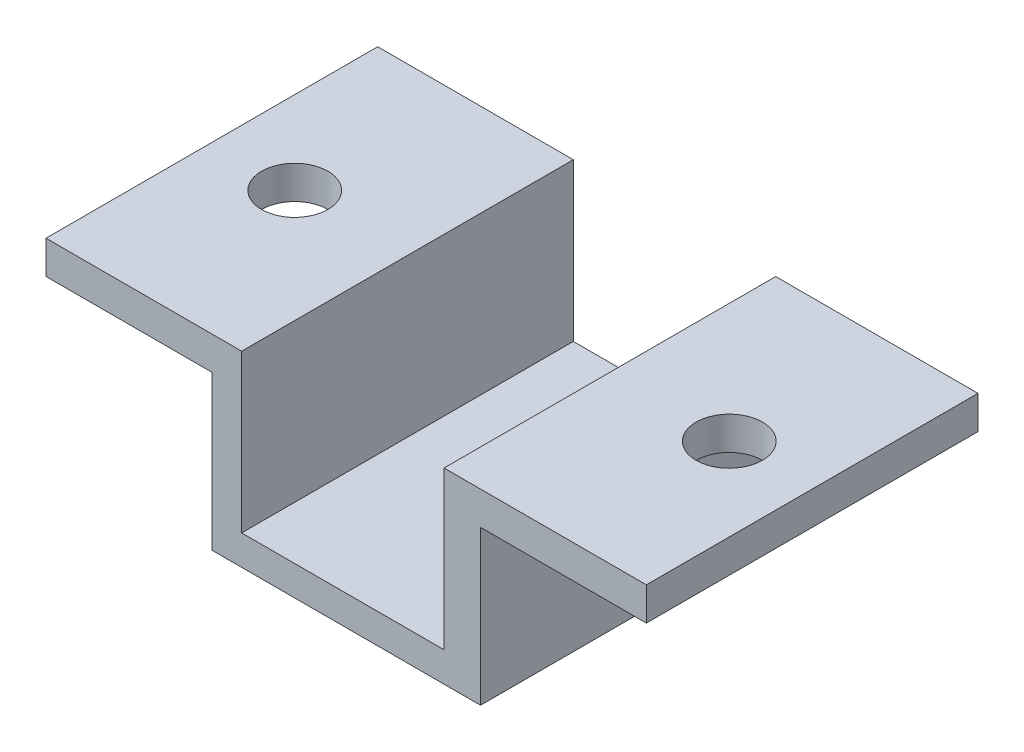
ISO-10303-21;
HEADER;
FILE_DESCRIPTION(('STEP AP214'),'2;1');
FILE_NAME('part.step','',(''),(''),'','','');
FILE_SCHEMA(('AUTOMOTIVE_DESIGN { 1 0 10303 214 1 1 1 1 }'));
ENDSEC;
DATA;
#1=APPLICATION_CONTEXT('core data for automotive mechanical design processes');
#2=APPLICATION_PROTOCOL_DEFINITION('international standard','automotive_design',2000,#1);
#3=PRODUCT_CONTEXT('',#1,'mechanical');
#4=PRODUCT('Part','Part','',(#3));
#5=PRODUCT_RELATED_PRODUCT_CATEGORY('part','',(#4));
#6=PRODUCT_DEFINITION_FORMATION('','',#4);
#7=PRODUCT_DEFINITION_CONTEXT('part definition',#1,'design');
#8=PRODUCT_DEFINITION('design','',#6,#7);
#9=PRODUCT_DEFINITION_SHAPE('','',#8);
#10=(LENGTH_UNIT() NAMED_UNIT(*) SI_UNIT(.MILLI.,.METRE.));
#11=(NAMED_UNIT(*) PLANE_ANGLE_UNIT() SI_UNIT($,.RADIAN.));
#12=(NAMED_UNIT(*) SI_UNIT($,.STERADIAN.) SOLID_ANGLE_UNIT());
#13=UNCERTAINTY_MEASURE_WITH_UNIT(LENGTH_MEASURE(1.E-05),#10,'distance_accuracy_value','');
#14=(GEOMETRIC_REPRESENTATION_CONTEXT(3) GLOBAL_UNCERTAINTY_ASSIGNED_CONTEXT((#13)) GLOBAL_UNIT_ASSIGNED_CONTEXT((#10,
#11,#12)) REPRESENTATION_CONTEXT('',''));
#15=CARTESIAN_POINT('',(0.,0.,0.));
#16=DIRECTION('',(0.,0.,1.));
#17=DIRECTION('',(1.,0.,0.));
#18=AXIS2_PLACEMENT_3D('',#15,#16,#17);
#19=CARTESIAN_POINT('',(0.,14.340000022,0.));
#20=DIRECTION('',(1.,0.,0.));
#21=DIRECTION('',(0.,0.,-1.));
#22=AXIS2_PLACEMENT_3D('',#19,#20,#21);
#23=PLANE('',#22);
#24=DIRECTION('',(0.,0.,-1.));
#25=VECTOR('',#24,1.);
#26=CARTESIAN_POINT('',(0.,11.800000022,0.));
#27=LINE('',#26,#25);
#28=CARTESIAN_POINT('',(0.,11.800000022,0.));
#29=VERTEX_POINT('',#28);
#30=CARTESIAN_POINT('',(0.,11.800000022,-25.4));
#31=VERTEX_POINT('',#30);
#32=EDGE_CURVE('E202',#29,#31,#27,.T.);
#33=ORIENTED_EDGE('',*,*,#32,.F.);
#34=DIRECTION('',(0.,-1.,0.));
#35=VECTOR('',#34,1.);
#36=CARTESIAN_POINT('',(0.,14.340000022,0.));
#37=LINE('',#36,#35);
#38=CARTESIAN_POINT('',(0.,14.340000022,0.));
#39=VERTEX_POINT('',#38);
#40=EDGE_CURVE('E11',#39,#29,#37,.T.);
#41=ORIENTED_EDGE('',*,*,#40,.F.);
#42=DIRECTION('',(0.,0.,1.));
#43=VECTOR('',#42,1.);
#44=CARTESIAN_POINT('',(0.,14.340000022,0.));
#45=LINE('',#44,#43);
#46=CARTESIAN_POINT('',(0.,14.340000022,-25.4));
#47=VERTEX_POINT('',#46);
#48=EDGE_CURVE('E155',#47,#39,#45,.T.);
#49=ORIENTED_EDGE('',*,*,#48,.F.);
#50=DIRECTION('',(0.,-1.,0.));
#51=VECTOR('',#50,1.);
#52=CARTESIAN_POINT('',(0.,14.340000022,-25.4));
#53=LINE('',#52,#51);
#54=EDGE_CURVE('E148',#47,#31,#53,.T.);
#55=ORIENTED_EDGE('',*,*,#54,.T.);
#56=EDGE_LOOP('',(#33,#41,#49,#55));
#57=FACE_BOUND('',#56,.T.);
#58=ADVANCED_FACE('F34',(#57),#23,.F.);
#59=CARTESIAN_POINT('',(0.,14.340000022,0.));
#60=DIRECTION('',(0.,-1.,0.));
#61=DIRECTION('',(0.,0.,-1.));
#62=AXIS2_PLACEMENT_3D('',#59,#60,#61);
#63=PLANE('',#62);
#64=CARTESIAN_POINT('',(6.35,14.340000022,-12.7));
#65=DIRECTION('',(0.,-1.,0.));
#66=DIRECTION('',(0.,0.,-1.));
#67=AXIS2_PLACEMENT_3D('',#64,#65,#66);
#68=CIRCLE('',#67,2.54);
#69=CARTESIAN_POINT('',(6.35,14.340000022,-15.24));
#70=VERTEX_POINT('',#69);
#71=EDGE_CURVE('E215',#70,#70,#68,.T.);
#72=ORIENTED_EDGE('',*,*,#71,.T.);
#73=EDGE_LOOP('',(#72));
#74=FACE_BOUND('',#73,.T.);
#75=DIRECTION('',(1.,0.,0.));
#76=VECTOR('',#75,1.);
#77=CARTESIAN_POINT('',(0.,14.340000022,0.));
#78=LINE('',#77,#76);
#79=CARTESIAN_POINT('',(14.986,14.340000022,0.));
#80=VERTEX_POINT('',#79);
#81=EDGE_CURVE('E163',#39,#80,#78,.T.);
#82=ORIENTED_EDGE('',*,*,#81,.T.);
#83=DIRECTION('',(0.,0.,1.));
#84=VECTOR('',#83,1.);
#85=CARTESIAN_POINT('',(14.986,14.340000022,0.));
#86=LINE('',#85,#84);
#87=CARTESIAN_POINT('',(14.986,14.340000022,-25.4));
#88=VERTEX_POINT('',#87);
#89=EDGE_CURVE('E182',#88,#80,#86,.T.);
#90=ORIENTED_EDGE('',*,*,#89,.F.);
#91=DIRECTION('',(-1.,0.,0.));
#92=VECTOR('',#91,1.);
#93=CARTESIAN_POINT('',(0.,14.340000022,-25.4));
#94=LINE('',#93,#92);
#95=EDGE_CURVE('E161',#88,#47,#94,.T.);
#96=ORIENTED_EDGE('',*,*,#95,.T.);
#97=ORIENTED_EDGE('',*,*,#48,.T.);
#98=EDGE_LOOP('',(#82,#90,#96,#97));
#99=FACE_BOUND('',#98,.T.);
#100=ADVANCED_FACE('F252',(#74,#99),#63,.F.);
#101=CARTESIAN_POINT('',(0.,14.340000022,0.));
#102=DIRECTION('',(0.,0.,-1.));
#103=DIRECTION('',(-1.,0.,0.));
#104=AXIS2_PLACEMENT_3D('',#101,#102,#103);
#105=PLANE('',#104);
#106=DIRECTION('',(1.,0.,0.));
#107=VECTOR('',#106,1.);
#108=CARTESIAN_POINT('',(0.,0.,0.));
#109=LINE('',#108,#107);
#110=CARTESIAN_POINT('',(12.7,0.,0.));
#111=VERTEX_POINT('',#110);
#112=CARTESIAN_POINT('',(33.279999988,0.,0.));
#113=VERTEX_POINT('',#112);
#114=EDGE_CURVE('E156',#111,#113,#109,.T.);
#115=ORIENTED_EDGE('',*,*,#114,.T.);
#116=DIRECTION('',(0.,-1.,0.));
#117=VECTOR('',#116,1.);
#118=CARTESIAN_POINT('',(33.279999988,11.800000022,0.));
#119=LINE('',#118,#117);
#120=CARTESIAN_POINT('',(33.279999988,11.800000022,0.));
#121=VERTEX_POINT('',#120);
#122=EDGE_CURVE('E48',#121,#113,#119,.T.);
#123=ORIENTED_EDGE('',*,*,#122,.F.);
#124=DIRECTION('',(-1.,0.,0.));
#125=VECTOR('',#124,1.);
#126=CARTESIAN_POINT('',(45.979999988,11.800000022,0.));
#127=LINE('',#126,#125);
#128=CARTESIAN_POINT('',(45.979999988,11.800000022,0.));
#129=VERTEX_POINT('',#128);
#130=EDGE_CURVE('E128',#129,#121,#127,.T.);
#131=ORIENTED_EDGE('',*,*,#130,.F.);
#132=DIRECTION('',(0.,-1.,0.));
#133=VECTOR('',#132,1.);
#134=CARTESIAN_POINT('',(45.979999988,14.340000022,0.));
#135=LINE('',#134,#133);
#136=CARTESIAN_POINT('',(45.979999988,14.340000022,0.));
#137=VERTEX_POINT('',#136);
#138=EDGE_CURVE('E41',#137,#129,#135,.T.);
#139=ORIENTED_EDGE('',*,*,#138,.F.);
#140=CARTESIAN_POINT('',(30.485999988,14.340000022,0.));
#141=VERTEX_POINT('',#140);
#142=EDGE_CURVE('E166',#141,#137,#78,.T.);
#143=ORIENTED_EDGE('',*,*,#142,.F.);
#144=DIRECTION('',(0.,1.,0.));
#145=VECTOR('',#144,1.);
#146=CARTESIAN_POINT('',(30.485999988,2.285998222,0.));
#147=LINE('',#146,#145);
#148=CARTESIAN_POINT('',(30.485999988,2.285998222,0.));
#149=VERTEX_POINT('',#148);
#150=EDGE_CURVE('E172',#149,#141,#147,.T.);
#151=ORIENTED_EDGE('',*,*,#150,.F.);
#152=DIRECTION('',(1.,0.,0.));
#153=VECTOR('',#152,1.);
#154=CARTESIAN_POINT('',(14.986,2.285998222,0.));
#155=LINE('',#154,#153);
#156=CARTESIAN_POINT('',(14.986,2.285998222,0.));
#157=VERTEX_POINT('',#156);
#158=EDGE_CURVE('E190',#157,#149,#155,.T.);
#159=ORIENTED_EDGE('',*,*,#158,.F.);
#160=DIRECTION('',(0.,1.,0.));
#161=VECTOR('',#160,1.);
#162=CARTESIAN_POINT('',(14.986,2.285998222,0.));
#163=LINE('',#162,#161);
#164=EDGE_CURVE('E169',#157,#80,#163,.T.);
#165=ORIENTED_EDGE('',*,*,#164,.T.);
#166=ORIENTED_EDGE('',*,*,#81,.F.);
#167=ORIENTED_EDGE('',*,*,#40,.T.);
#168=DIRECTION('',(-1.,0.,0.));
#169=VECTOR('',#168,1.);
#170=CARTESIAN_POINT('',(0.,11.800000022,0.));
#171=LINE('',#170,#169);
#172=CARTESIAN_POINT('',(12.7,11.800000022,0.));
#173=VERTEX_POINT('',#172);
#174=EDGE_CURVE('E197',#173,#29,#171,.T.);
#175=ORIENTED_EDGE('',*,*,#174,.F.);
#176=DIRECTION('',(0.,-1.,0.));
#177=VECTOR('',#176,1.);
#178=CARTESIAN_POINT('',(12.7,11.800000022,0.));
#179=LINE('',#178,#177);
#180=EDGE_CURVE('E184',#173,#111,#179,.T.);
#181=ORIENTED_EDGE('',*,*,#180,.T.);
#182=EDGE_LOOP('',(#115,#123,#131,#139,#143,#151,#159,#165,#166,#167,#175,#181));
#183=FACE_BOUND('',#182,.T.);
#184=ADVANCED_FACE('F140',(#183),#105,.F.);
#185=CARTESIAN_POINT('',(45.979999988,14.340000022,0.));
#186=DIRECTION('',(-1.,0.,0.));
#187=DIRECTION('',(0.,0.,1.));
#188=AXIS2_PLACEMENT_3D('',#185,#186,#187);
#189=PLANE('',#188);
#190=ORIENTED_EDGE('',*,*,#138,.T.);
#191=DIRECTION('',(0.,0.,1.));
#192=VECTOR('',#191,1.);
#193=CARTESIAN_POINT('',(45.979999988,11.800000022,0.));
#194=LINE('',#193,#192);
#195=CARTESIAN_POINT('',(45.979999988,11.800000022,-25.4));
#196=VERTEX_POINT('',#195);
#197=EDGE_CURVE('E124',#196,#129,#194,.T.);
#198=ORIENTED_EDGE('',*,*,#197,.F.);
#199=DIRECTION('',(0.,-1.,0.));
#200=VECTOR('',#199,1.);
#201=CARTESIAN_POINT('',(45.979999988,14.340000022,-25.4));
#202=LINE('',#201,#200);
#203=CARTESIAN_POINT('',(45.979999988,14.340000022,-25.4));
#204=VERTEX_POINT('',#203);
#205=EDGE_CURVE('E147',#204,#196,#202,.T.);
#206=ORIENTED_EDGE('',*,*,#205,.F.);
#207=DIRECTION('',(0.,0.,-1.));
#208=VECTOR('',#207,1.);
#209=CARTESIAN_POINT('',(45.979999988,14.340000022,0.));
#210=LINE('',#209,#208);
#211=EDGE_CURVE('E146',#137,#204,#210,.T.);
#212=ORIENTED_EDGE('',*,*,#211,.F.);
#213=EDGE_LOOP('',(#190,#198,#206,#212));
#214=FACE_BOUND('',#213,.T.);
#215=ADVANCED_FACE('F145',(#214),#189,.F.);
#216=CARTESIAN_POINT('',(0.,14.340000022,-25.4));
#217=DIRECTION('',(0.,0.,1.));
#218=DIRECTION('',(1.,0.,0.));
#219=AXIS2_PLACEMENT_3D('',#216,#217,#218);
#220=PLANE('',#219);
#221=DIRECTION('',(1.,0.,0.));
#222=VECTOR('',#221,1.);
#223=CARTESIAN_POINT('',(45.979999988,11.800000022,-25.4));
#224=LINE('',#223,#222);
#225=CARTESIAN_POINT('',(33.279999988,11.800000022,-25.4));
#226=VERTEX_POINT('',#225);
#227=EDGE_CURVE('E130',#226,#196,#224,.T.);
#228=ORIENTED_EDGE('',*,*,#227,.F.);
#229=DIRECTION('',(0.,-1.,0.));
#230=VECTOR('',#229,1.);
#231=CARTESIAN_POINT('',(33.279999988,11.800000022,-25.4));
#232=LINE('',#231,#230);
#233=CARTESIAN_POINT('',(33.279999988,0.,-25.4));
#234=VERTEX_POINT('',#233);
#235=EDGE_CURVE('E203',#226,#234,#232,.T.);
#236=ORIENTED_EDGE('',*,*,#235,.T.);
#237=DIRECTION('',(-1.,0.,0.));
#238=VECTOR('',#237,1.);
#239=CARTESIAN_POINT('',(0.,0.,-25.4));
#240=LINE('',#239,#238);
#241=CARTESIAN_POINT('',(12.7,0.,-25.4));
#242=VERTEX_POINT('',#241);
#243=EDGE_CURVE('E56',#234,#242,#240,.T.);
#244=ORIENTED_EDGE('',*,*,#243,.T.);
#245=DIRECTION('',(0.,-1.,0.));
#246=VECTOR('',#245,1.);
#247=CARTESIAN_POINT('',(12.7,11.800000022,-25.4));
#248=LINE('',#247,#246);
#249=CARTESIAN_POINT('',(12.7,11.800000022,-25.4));
#250=VERTEX_POINT('',#249);
#251=EDGE_CURVE('E195',#250,#242,#248,.T.);
#252=ORIENTED_EDGE('',*,*,#251,.F.);
#253=DIRECTION('',(1.,0.,0.));
#254=VECTOR('',#253,1.);
#255=CARTESIAN_POINT('',(0.,11.800000022,-25.4));
#256=LINE('',#255,#254);
#257=EDGE_CURVE('E208',#31,#250,#256,.T.);
#258=ORIENTED_EDGE('',*,*,#257,.F.);
#259=ORIENTED_EDGE('',*,*,#54,.F.);
#260=ORIENTED_EDGE('',*,*,#95,.F.);
#261=DIRECTION('',(0.,1.,0.));
#262=VECTOR('',#261,1.);
#263=CARTESIAN_POINT('',(14.986,2.285998222,-25.4));
#264=LINE('',#263,#262);
#265=CARTESIAN_POINT('',(14.986,2.285998222,-25.4));
#266=VERTEX_POINT('',#265);
#267=EDGE_CURVE('E158',#266,#88,#264,.T.);
#268=ORIENTED_EDGE('',*,*,#267,.F.);
#269=DIRECTION('',(-1.,0.,0.));
#270=VECTOR('',#269,1.);
#271=CARTESIAN_POINT('',(14.986,2.285998222,-25.4));
#272=LINE('',#271,#270);
#273=CARTESIAN_POINT('',(30.485999988,2.285998222,-25.4));
#274=VERTEX_POINT('',#273);
#275=EDGE_CURVE('E173',#274,#266,#272,.T.);
#276=ORIENTED_EDGE('',*,*,#275,.F.);
#277=DIRECTION('',(0.,1.,0.));
#278=VECTOR('',#277,1.);
#279=CARTESIAN_POINT('',(30.485999988,2.285998222,-25.4));
#280=LINE('',#279,#278);
#281=CARTESIAN_POINT('',(30.485999988,14.340000022,-25.4));
#282=VERTEX_POINT('',#281);
#283=EDGE_CURVE('E175',#274,#282,#280,.T.);
#284=ORIENTED_EDGE('',*,*,#283,.T.);
#285=EDGE_CURVE('E153',#204,#282,#94,.T.);
#286=ORIENTED_EDGE('',*,*,#285,.F.);
#287=ORIENTED_EDGE('',*,*,#205,.T.);
#288=EDGE_LOOP('',(#228,#236,#244,#252,#258,#259,#260,#268,#276,#284,#286,#287));
#289=FACE_BOUND('',#288,.T.);
#290=ADVANCED_FACE('F271',(#289),#220,.F.);
#291=CARTESIAN_POINT('',(39.629999988,14.340000022,-12.7));
#292=DIRECTION('',(0.,-1.,0.));
#293=DIRECTION('',(0.,0.,-1.));
#294=AXIS2_PLACEMENT_3D('',#291,#292,#293);
#295=CIRCLE('',#294,2.54);
#296=CARTESIAN_POINT('',(39.629999988,14.340000022,-15.24));
#297=VERTEX_POINT('',#296);
#298=EDGE_CURVE('E221',#297,#297,#295,.T.);
#299=ORIENTED_EDGE('',*,*,#298,.T.);
#300=EDGE_LOOP('',(#299));
#301=FACE_BOUND('',#300,.T.);
#302=ORIENTED_EDGE('',*,*,#285,.T.);
#303=DIRECTION('',(0.,0.,-1.));
#304=VECTOR('',#303,1.);
#305=CARTESIAN_POINT('',(30.485999988,14.340000022,0.));
#306=LINE('',#305,#304);
#307=EDGE_CURVE('E179',#141,#282,#306,.T.);
#308=ORIENTED_EDGE('',*,*,#307,.F.);
#309=ORIENTED_EDGE('',*,*,#142,.T.);
#310=ORIENTED_EDGE('',*,*,#211,.T.);
#311=EDGE_LOOP('',(#302,#308,#309,#310));
#312=FACE_BOUND('',#311,.T.);
#313=ADVANCED_FACE('F230',(#301,#312),#63,.F.);
#314=CARTESIAN_POINT('',(0.,0.,0.));
#315=DIRECTION('',(0.,-1.,0.));
#316=DIRECTION('',(0.,0.,-1.));
#317=AXIS2_PLACEMENT_3D('',#314,#315,#316);
#318=PLANE('',#317);
#319=DIRECTION('',(0.,0.,-1.));
#320=VECTOR('',#319,1.);
#321=CARTESIAN_POINT('',(33.279999988,0.,0.));
#322=LINE('',#321,#320);
#323=EDGE_CURVE('E135',#113,#234,#322,.T.);
#324=ORIENTED_EDGE('',*,*,#323,.F.);
#325=ORIENTED_EDGE('',*,*,#114,.F.);
#326=DIRECTION('',(0.,0.,1.));
#327=VECTOR('',#326,1.);
#328=CARTESIAN_POINT('',(12.7,0.,0.));
#329=LINE('',#328,#327);
#330=EDGE_CURVE('E200',#242,#111,#329,.T.);
#331=ORIENTED_EDGE('',*,*,#330,.F.);
#332=ORIENTED_EDGE('',*,*,#243,.F.);
#333=EDGE_LOOP('',(#324,#325,#331,#332));
#334=FACE_BOUND('',#333,.T.);
#335=ADVANCED_FACE('F277',(#334),#318,.T.);
#336=CARTESIAN_POINT('',(14.986,2.285998222,0.));
#337=DIRECTION('',(-1.,0.,0.));
#338=DIRECTION('',(0.,0.,1.));
#339=AXIS2_PLACEMENT_3D('',#336,#337,#338);
#340=PLANE('',#339);
#341=ORIENTED_EDGE('',*,*,#89,.T.);
#342=ORIENTED_EDGE('',*,*,#164,.F.);
#343=DIRECTION('',(0.,0.,1.));
#344=VECTOR('',#343,1.);
#345=CARTESIAN_POINT('',(14.986,2.285998222,0.));
#346=LINE('',#345,#344);
#347=EDGE_CURVE('E181',#266,#157,#346,.T.);
#348=ORIENTED_EDGE('',*,*,#347,.F.);
#349=ORIENTED_EDGE('',*,*,#267,.T.);
#350=EDGE_LOOP('',(#341,#342,#348,#349));
#351=FACE_BOUND('',#350,.T.);
#352=ADVANCED_FACE('F287',(#351),#340,.F.);
#353=CARTESIAN_POINT('',(30.485999988,2.285998222,0.));
#354=DIRECTION('',(1.,0.,0.));
#355=DIRECTION('',(0.,0.,-1.));
#356=AXIS2_PLACEMENT_3D('',#353,#354,#355);
#357=PLANE('',#356);
#358=ORIENTED_EDGE('',*,*,#307,.T.);
#359=ORIENTED_EDGE('',*,*,#283,.F.);
#360=DIRECTION('',(0.,0.,-1.));
#361=VECTOR('',#360,1.);
#362=CARTESIAN_POINT('',(30.485999988,2.285998222,0.));
#363=LINE('',#362,#361);
#364=EDGE_CURVE('E187',#149,#274,#363,.T.);
#365=ORIENTED_EDGE('',*,*,#364,.F.);
#366=ORIENTED_EDGE('',*,*,#150,.T.);
#367=EDGE_LOOP('',(#358,#359,#365,#366));
#368=FACE_BOUND('',#367,.T.);
#369=ADVANCED_FACE('F283',(#368),#357,.F.);
#370=CARTESIAN_POINT('',(0.,2.285998222,0.));
#371=DIRECTION('',(0.,-1.,0.));
#372=DIRECTION('',(0.,0.,-1.));
#373=AXIS2_PLACEMENT_3D('',#370,#371,#372);
#374=PLANE('',#373);
#375=ORIENTED_EDGE('',*,*,#347,.T.);
#376=ORIENTED_EDGE('',*,*,#158,.T.);
#377=ORIENTED_EDGE('',*,*,#364,.T.);
#378=ORIENTED_EDGE('',*,*,#275,.T.);
#379=EDGE_LOOP('',(#375,#376,#377,#378));
#380=FACE_BOUND('',#379,.T.);
#381=ADVANCED_FACE('F285',(#380),#374,.F.);
#382=CARTESIAN_POINT('',(12.7,11.800000022,0.));
#383=DIRECTION('',(1.,0.,0.));
#384=DIRECTION('',(0.,0.,-1.));
#385=AXIS2_PLACEMENT_3D('',#382,#383,#384);
#386=PLANE('',#385);
#387=ORIENTED_EDGE('',*,*,#330,.T.);
#388=ORIENTED_EDGE('',*,*,#180,.F.);
#389=DIRECTION('',(0.,0.,1.));
#390=VECTOR('',#389,1.);
#391=CARTESIAN_POINT('',(12.7,11.800000022,0.));
#392=LINE('',#391,#390);
#393=EDGE_CURVE('E205',#250,#173,#392,.T.);
#394=ORIENTED_EDGE('',*,*,#393,.F.);
#395=ORIENTED_EDGE('',*,*,#251,.T.);
#396=EDGE_LOOP('',(#387,#388,#394,#395));
#397=FACE_BOUND('',#396,.T.);
#398=ADVANCED_FACE('F273',(#397),#386,.F.);
#399=CARTESIAN_POINT('',(0.,11.800000022,0.));
#400=DIRECTION('',(0.,-1.,0.));
#401=DIRECTION('',(0.,0.,-1.));
#402=AXIS2_PLACEMENT_3D('',#399,#400,#401);
#403=PLANE('',#402);
#404=CARTESIAN_POINT('',(6.35,11.800000022,-12.7));
#405=DIRECTION('',(0.,-1.,0.));
#406=DIRECTION('',(0.,0.,-1.));
#407=AXIS2_PLACEMENT_3D('',#404,#405,#406);
#408=CIRCLE('',#407,2.54);
#409=CARTESIAN_POINT('',(6.35,11.800000022,-15.24));
#410=VERTEX_POINT('',#409);
#411=EDGE_CURVE('E218',#410,#410,#408,.T.);
#412=ORIENTED_EDGE('',*,*,#411,.F.);
#413=EDGE_LOOP('',(#412));
#414=FACE_BOUND('',#413,.T.);
#415=ORIENTED_EDGE('',*,*,#32,.T.);
#416=ORIENTED_EDGE('',*,*,#257,.T.);
#417=ORIENTED_EDGE('',*,*,#393,.T.);
#418=ORIENTED_EDGE('',*,*,#174,.T.);
#419=EDGE_LOOP('',(#415,#416,#417,#418));
#420=FACE_BOUND('',#419,.T.);
#421=ADVANCED_FACE('F249',(#414,#420),#403,.T.);
#422=CARTESIAN_POINT('',(33.279999988,11.800000022,0.));
#423=DIRECTION('',(-1.,0.,0.));
#424=DIRECTION('',(0.,0.,1.));
#425=AXIS2_PLACEMENT_3D('',#422,#423,#424);
#426=PLANE('',#425);
#427=ORIENTED_EDGE('',*,*,#323,.T.);
#428=ORIENTED_EDGE('',*,*,#235,.F.);
#429=DIRECTION('',(0.,0.,-1.));
#430=VECTOR('',#429,1.);
#431=CARTESIAN_POINT('',(33.279999988,11.800000022,0.));
#432=LINE('',#431,#430);
#433=EDGE_CURVE('E143',#121,#226,#432,.T.);
#434=ORIENTED_EDGE('',*,*,#433,.F.);
#435=ORIENTED_EDGE('',*,*,#122,.T.);
#436=EDGE_LOOP('',(#427,#428,#434,#435));
#437=FACE_BOUND('',#436,.T.);
#438=ADVANCED_FACE('F241',(#437),#426,.F.);
#439=CARTESIAN_POINT('',(0.,11.800000022,0.));
#440=DIRECTION('',(0.,1.,0.));
#441=DIRECTION('',(0.,0.,1.));
#442=AXIS2_PLACEMENT_3D('',#439,#440,#441);
#443=PLANE('',#442);
#444=CARTESIAN_POINT('',(39.629999988,11.800000022,-12.7));
#445=DIRECTION('',(0.,-1.,0.));
#446=DIRECTION('',(0.,0.,-1.));
#447=AXIS2_PLACEMENT_3D('',#444,#445,#446);
#448=CIRCLE('',#447,2.54);
#449=CARTESIAN_POINT('',(39.629999988,11.800000022,-15.24));
#450=VERTEX_POINT('',#449);
#451=EDGE_CURVE('E224',#450,#450,#448,.T.);
#452=ORIENTED_EDGE('',*,*,#451,.F.);
#453=EDGE_LOOP('',(#452));
#454=FACE_BOUND('',#453,.T.);
#455=ORIENTED_EDGE('',*,*,#197,.T.);
#456=ORIENTED_EDGE('',*,*,#130,.T.);
#457=ORIENTED_EDGE('',*,*,#433,.T.);
#458=ORIENTED_EDGE('',*,*,#227,.T.);
#459=EDGE_LOOP('',(#455,#456,#457,#458));
#460=FACE_BOUND('',#459,.T.);
#461=ADVANCED_FACE('F126',(#454,#460),#443,.F.);
#462=CARTESIAN_POINT('',(6.35,14.340000022,-12.7));
#463=DIRECTION('',(0.,-1.,0.));
#464=DIRECTION('',(0.,0.,-1.));
#465=AXIS2_PLACEMENT_3D('',#462,#463,#464);
#466=CYLINDRICAL_SURFACE('',#465,2.54);
#467=ORIENTED_EDGE('',*,*,#71,.F.);
#468=EDGE_LOOP('',(#467));
#469=FACE_BOUND('',#468,.T.);
#470=ORIENTED_EDGE('',*,*,#411,.T.);
#471=EDGE_LOOP('',(#470));
#472=FACE_BOUND('',#471,.T.);
#473=ADVANCED_FACE('F236',(#469,#472),#466,.F.);
#474=CARTESIAN_POINT('',(39.629999988,14.340000022,-12.7));
#475=DIRECTION('',(0.,-1.,0.));
#476=DIRECTION('',(0.,0.,-1.));
#477=AXIS2_PLACEMENT_3D('',#474,#475,#476);
#478=CYLINDRICAL_SURFACE('',#477,2.54);
#479=ORIENTED_EDGE('',*,*,#298,.F.);
#480=EDGE_LOOP('',(#479));
#481=FACE_BOUND('',#480,.T.);
#482=ORIENTED_EDGE('',*,*,#451,.T.);
#483=EDGE_LOOP('',(#482));
#484=FACE_BOUND('',#483,.T.);
#485=ADVANCED_FACE('F233',(#481,#484),#478,.F.);
#486=CLOSED_SHELL('',(#58,#100,#184,#215,#290,#313,#335,#352,#369,#381,#398,#421,#438,#461,#473,#485));
#487=MANIFOLD_SOLID_BREP('B2',#486);
#488=ADVANCED_BREP_SHAPE_REPRESENTATION('',(#18,#487),#14);
#489=SHAPE_DEFINITION_REPRESENTATION(#9,#488);
ENDSEC;
END-ISO-10303-21;
